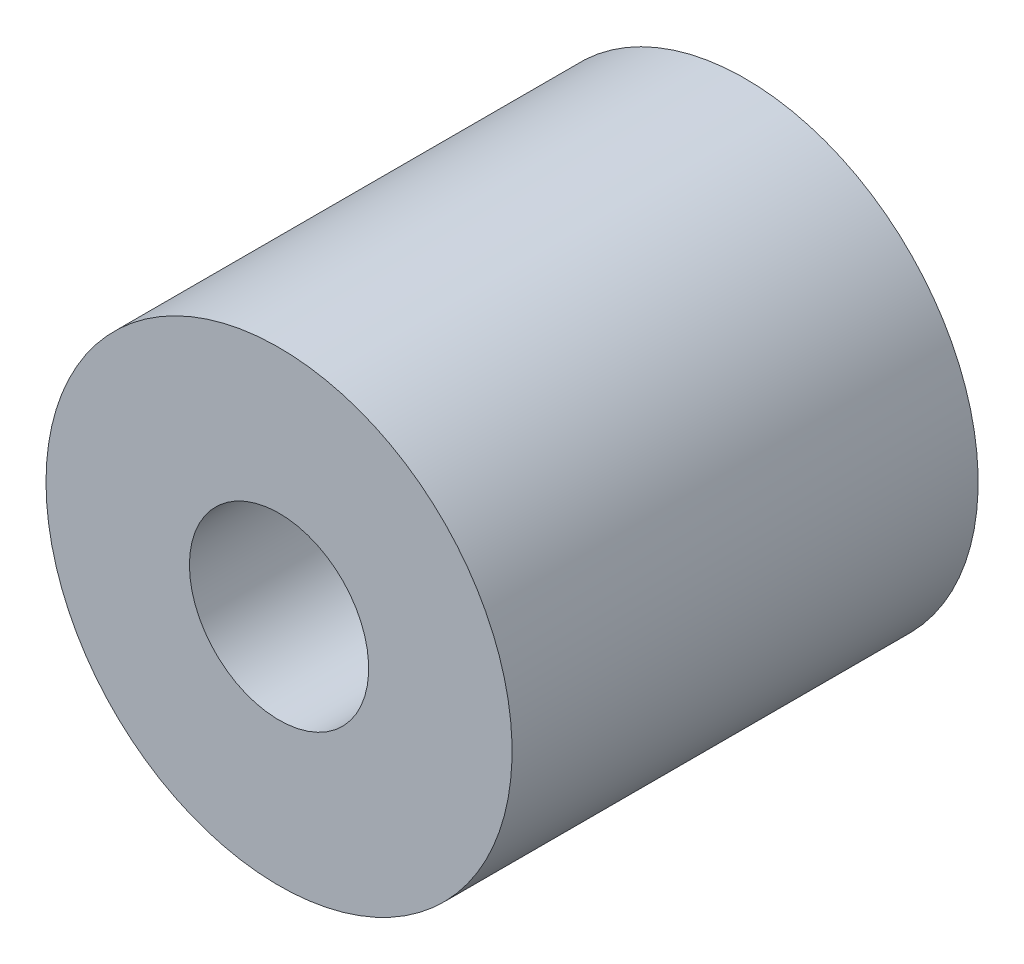
ISO-10303-21;
HEADER;
FILE_DESCRIPTION(('STEP AP214'),'2;1');
FILE_NAME('part.step','',(''),(''),'','','');
FILE_SCHEMA(('AUTOMOTIVE_DESIGN { 1 0 10303 214 1 1 1 1 }'));
ENDSEC;
DATA;
#1=APPLICATION_CONTEXT('core data for automotive mechanical design processes');
#2=APPLICATION_PROTOCOL_DEFINITION('international standard','automotive_design',2000,#1);
#3=PRODUCT_CONTEXT('',#1,'mechanical');
#4=PRODUCT('Part','Part','',(#3));
#5=PRODUCT_RELATED_PRODUCT_CATEGORY('part','',(#4));
#6=PRODUCT_DEFINITION_FORMATION('','',#4);
#7=PRODUCT_DEFINITION_CONTEXT('part definition',#1,'design');
#8=PRODUCT_DEFINITION('design','',#6,#7);
#9=PRODUCT_DEFINITION_SHAPE('','',#8);
#10=(LENGTH_UNIT() NAMED_UNIT(*) SI_UNIT(.MILLI.,.METRE.));
#11=(NAMED_UNIT(*) PLANE_ANGLE_UNIT() SI_UNIT($,.RADIAN.));
#12=(NAMED_UNIT(*) SI_UNIT($,.STERADIAN.) SOLID_ANGLE_UNIT());
#13=UNCERTAINTY_MEASURE_WITH_UNIT(LENGTH_MEASURE(1.E-05),#10,'distance_accuracy_value','');
#14=(GEOMETRIC_REPRESENTATION_CONTEXT(3) GLOBAL_UNCERTAINTY_ASSIGNED_CONTEXT((#13)) GLOBAL_UNIT_ASSIGNED_CONTEXT((#10,
#11,#12)) REPRESENTATION_CONTEXT('',''));
#15=CARTESIAN_POINT('',(0.,0.,0.));
#16=DIRECTION('',(0.,0.,1.));
#17=DIRECTION('',(1.,0.,0.));
#18=AXIS2_PLACEMENT_3D('',#15,#16,#17);
#19=CARTESIAN_POINT('',(0.,0.,26.));
#20=DIRECTION('',(0.,0.,1.));
#21=DIRECTION('',(1.,0.,0.));
#22=AXIS2_PLACEMENT_3D('',#19,#20,#21);
#23=PLANE('',#22);
#24=CARTESIAN_POINT('',(0.,0.,26.));
#25=DIRECTION('',(0.,0.,1.));
#26=DIRECTION('',(1.,0.,0.));
#27=AXIS2_PLACEMENT_3D('',#24,#25,#26);
#28=CIRCLE('',#27,13.);
#29=CARTESIAN_POINT('',(-13.,0.,26.));
#30=VERTEX_POINT('',#29);
#31=EDGE_CURVE('E10',#30,#30,#28,.T.);
#32=ORIENTED_EDGE('',*,*,#31,.T.);
#33=EDGE_LOOP('',(#32));
#34=FACE_BOUND('',#33,.T.);
#35=CARTESIAN_POINT('',(0.,0.,26.));
#36=DIRECTION('',(0.,0.,1.));
#37=DIRECTION('',(1.,0.,0.));
#38=AXIS2_PLACEMENT_3D('',#35,#36,#37);
#39=CIRCLE('',#38,5.);
#40=CARTESIAN_POINT('',(-5.,0.,26.));
#41=VERTEX_POINT('',#40);
#42=EDGE_CURVE('E50',#41,#41,#39,.T.);
#43=ORIENTED_EDGE('',*,*,#42,.F.);
#44=EDGE_LOOP('',(#43));
#45=FACE_BOUND('',#44,.T.);
#46=ADVANCED_FACE('F39',(#34,#45),#23,.T.);
#47=CARTESIAN_POINT('',(0.,0.,0.));
#48=DIRECTION('',(0.,0.,1.));
#49=DIRECTION('',(1.,0.,0.));
#50=AXIS2_PLACEMENT_3D('',#47,#48,#49);
#51=PLANE('',#50);
#52=CARTESIAN_POINT('',(0.,0.,0.));
#53=DIRECTION('',(0.,0.,1.));
#54=DIRECTION('',(1.,0.,0.));
#55=AXIS2_PLACEMENT_3D('',#52,#53,#54);
#56=CIRCLE('',#55,13.);
#57=CARTESIAN_POINT('',(-13.,0.,0.));
#58=VERTEX_POINT('',#57);
#59=EDGE_CURVE('E43',#58,#58,#56,.T.);
#60=ORIENTED_EDGE('',*,*,#59,.F.);
#61=EDGE_LOOP('',(#60));
#62=FACE_BOUND('',#61,.T.);
#63=CARTESIAN_POINT('',(0.,0.,0.));
#64=DIRECTION('',(0.,0.,1.));
#65=DIRECTION('',(1.,0.,0.));
#66=AXIS2_PLACEMENT_3D('',#63,#64,#65);
#67=CIRCLE('',#66,5.);
#68=CARTESIAN_POINT('',(-5.,0.,0.));
#69=VERTEX_POINT('',#68);
#70=EDGE_CURVE('E52',#69,#69,#67,.T.);
#71=ORIENTED_EDGE('',*,*,#70,.T.);
#72=EDGE_LOOP('',(#71));
#73=FACE_BOUND('',#72,.T.);
#74=ADVANCED_FACE('F62',(#62,#73),#51,.F.);
#75=CARTESIAN_POINT('',(0.,0.,26.));
#76=DIRECTION('',(0.,0.,-1.));
#77=DIRECTION('',(-1.,0.,0.));
#78=AXIS2_PLACEMENT_3D('',#75,#76,#77);
#79=CYLINDRICAL_SURFACE('',#78,13.);
#80=CARTESIAN_POINT('',(-13.,0.,26.));
#81=CARTESIAN_POINT('',(-13.,0.,25.7291666666667));
#82=CARTESIAN_POINT('',(-13.,0.,25.4583333333333));
#83=CARTESIAN_POINT('',(-13.,0.,24.9166666666667));
#84=CARTESIAN_POINT('',(-13.,0.,24.6458333333333));
#85=CARTESIAN_POINT('',(-13.,0.,24.1041666666667));
#86=CARTESIAN_POINT('',(-13.,0.,23.8333333333333));
#87=CARTESIAN_POINT('',(-13.,0.,23.2916666666667));
#88=CARTESIAN_POINT('',(-13.,0.,23.0208333333333));
#89=CARTESIAN_POINT('',(-13.,0.,22.4791666666667));
#90=CARTESIAN_POINT('',(-13.,0.,22.2083333333333));
#91=CARTESIAN_POINT('',(-13.,0.,21.6666666666667));
#92=CARTESIAN_POINT('',(-13.,0.,21.3958333333333));
#93=CARTESIAN_POINT('',(-13.,0.,20.8541666666667));
#94=CARTESIAN_POINT('',(-13.,0.,20.5833333333333));
#95=CARTESIAN_POINT('',(-13.,0.,20.0416666666667));
#96=CARTESIAN_POINT('',(-13.,0.,19.7708333333333));
#97=CARTESIAN_POINT('',(-13.,0.,19.2291666666667));
#98=CARTESIAN_POINT('',(-13.,0.,18.9583333333333));
#99=CARTESIAN_POINT('',(-13.,0.,18.4166666666667));
#100=CARTESIAN_POINT('',(-13.,0.,18.1458333333333));
#101=CARTESIAN_POINT('',(-13.,0.,17.6041666666667));
#102=CARTESIAN_POINT('',(-13.,0.,17.3333333333333));
#103=CARTESIAN_POINT('',(-13.,0.,16.7916666666667));
#104=CARTESIAN_POINT('',(-13.,0.,16.5208333333333));
#105=CARTESIAN_POINT('',(-13.,0.,15.9791666666667));
#106=CARTESIAN_POINT('',(-13.,0.,15.7083333333333));
#107=CARTESIAN_POINT('',(-13.,0.,15.1666666666667));
#108=CARTESIAN_POINT('',(-13.,0.,14.8958333333333));
#109=CARTESIAN_POINT('',(-13.,0.,14.3541666666667));
#110=CARTESIAN_POINT('',(-13.,0.,14.0833333333333));
#111=CARTESIAN_POINT('',(-13.,0.,13.5416666666667));
#112=CARTESIAN_POINT('',(-13.,0.,13.2708333333333));
#113=CARTESIAN_POINT('',(-13.,0.,12.7291666666667));
#114=CARTESIAN_POINT('',(-13.,0.,12.4583333333333));
#115=CARTESIAN_POINT('',(-13.,0.,11.9166666666667));
#116=CARTESIAN_POINT('',(-13.,0.,11.6458333333333));
#117=CARTESIAN_POINT('',(-13.,0.,11.1041666666667));
#118=CARTESIAN_POINT('',(-13.,0.,10.8333333333333));
#119=CARTESIAN_POINT('',(-13.,0.,10.2916666666667));
#120=CARTESIAN_POINT('',(-13.,0.,10.0208333333333));
#121=CARTESIAN_POINT('',(-13.,0.,9.47916666666667));
#122=CARTESIAN_POINT('',(-13.,0.,9.20833333333333));
#123=CARTESIAN_POINT('',(-13.,0.,8.66666666666667));
#124=CARTESIAN_POINT('',(-13.,0.,8.39583333333333));
#125=CARTESIAN_POINT('',(-13.,0.,7.85416666666667));
#126=CARTESIAN_POINT('',(-13.,0.,7.58333333333333));
#127=CARTESIAN_POINT('',(-13.,0.,7.04166666666667));
#128=CARTESIAN_POINT('',(-13.,0.,6.77083333333333));
#129=CARTESIAN_POINT('',(-13.,0.,6.22916666666667));
#130=CARTESIAN_POINT('',(-13.,0.,5.95833333333333));
#131=CARTESIAN_POINT('',(-13.,0.,5.41666666666667));
#132=CARTESIAN_POINT('',(-13.,0.,5.14583333333333));
#133=CARTESIAN_POINT('',(-13.,0.,4.60416666666667));
#134=CARTESIAN_POINT('',(-13.,0.,4.33333333333333));
#135=CARTESIAN_POINT('',(-13.,0.,3.79166666666667));
#136=CARTESIAN_POINT('',(-13.,0.,3.52083333333333));
#137=CARTESIAN_POINT('',(-13.,0.,2.97916666666667));
#138=CARTESIAN_POINT('',(-13.,0.,2.70833333333333));
#139=CARTESIAN_POINT('',(-13.,0.,2.16666666666667));
#140=CARTESIAN_POINT('',(-13.,0.,1.89583333333333));
#141=CARTESIAN_POINT('',(-13.,0.,1.35416666666667));
#142=CARTESIAN_POINT('',(-13.,0.,1.08333333333333));
#143=CARTESIAN_POINT('',(-13.,0.,0.541666666666667));
#144=CARTESIAN_POINT('',(-13.,0.,0.270833333333334));
#145=CARTESIAN_POINT('',(-13.,0.,0.));
#146=B_SPLINE_CURVE_WITH_KNOTS('',3,(#80,#81,#82,#83,#84,#85,#86,#87,#88,#89,#90,#91,#92,#93,
#94,#95,#96,#97,#98,#99,#100,#101,#102,#103,#104,#105,#106,#107,#108,#109,#110,#111,#112,#113,
#114,#115,#116,#117,#118,#119,#120,#121,#122,#123,#124,#125,#126,#127,#128,#129,#130,#131,#132,
#133,#134,#135,#136,#137,#138,#139,#140,#141,#142,#143,#144,#145),.UNSPECIFIED.,.F.,.F.,(4,2,2,
2,2,2,2,2,2,2,2,2,2,2,2,2,2,2,2,2,2,2,2,2,2,2,2,2,2,2,2,2,4),(0.,0.812499999999997,1.625,2.4375,
3.25,4.0625,4.875,5.6875,6.5,7.3125,8.125,8.93749999999999,9.74999999999999,10.5625,11.375,
12.1875,13.,13.8125,14.625,15.4375,16.25,17.0625,17.875,18.6875,19.5,20.3125,21.125,21.9375,
22.75,23.5625,24.375,25.1875,26.),.UNSPECIFIED.);
#147=EDGE_CURVE('BSEAM41',#30,#58,#146,.T.);
#148=ORIENTED_EDGE('',*,*,#31,.F.);
#149=ORIENTED_EDGE('',*,*,#59,.T.);
#150=ORIENTED_EDGE('',*,*,#147,.T.);
#151=ORIENTED_EDGE('',*,*,#147,.F.);
#152=EDGE_LOOP('',(#148,#150,#149,#151));
#153=FACE_BOUND('',#152,.T.);
#154=ADVANCED_FACE('F41',(#153),#79,.T.);
#155=CARTESIAN_POINT('',(0.,0.,26.));
#156=DIRECTION('',(0.,0.,-1.));
#157=DIRECTION('',(-1.,0.,0.));
#158=AXIS2_PLACEMENT_3D('',#155,#156,#157);
#159=CYLINDRICAL_SURFACE('',#158,5.);
#160=CARTESIAN_POINT('',(-5.,0.,26.));
#161=CARTESIAN_POINT('',(-5.,0.,25.7291666666667));
#162=CARTESIAN_POINT('',(-5.,0.,25.4583333333333));
#163=CARTESIAN_POINT('',(-5.,0.,24.9166666666667));
#164=CARTESIAN_POINT('',(-5.,0.,24.6458333333333));
#165=CARTESIAN_POINT('',(-5.,0.,24.1041666666667));
#166=CARTESIAN_POINT('',(-5.,0.,23.8333333333333));
#167=CARTESIAN_POINT('',(-5.,0.,23.2916666666667));
#168=CARTESIAN_POINT('',(-5.,0.,23.0208333333333));
#169=CARTESIAN_POINT('',(-5.,0.,22.4791666666667));
#170=CARTESIAN_POINT('',(-5.,0.,22.2083333333333));
#171=CARTESIAN_POINT('',(-5.,0.,21.6666666666667));
#172=CARTESIAN_POINT('',(-5.,0.,21.3958333333333));
#173=CARTESIAN_POINT('',(-5.,0.,20.8541666666667));
#174=CARTESIAN_POINT('',(-5.,0.,20.5833333333333));
#175=CARTESIAN_POINT('',(-5.,0.,20.0416666666667));
#176=CARTESIAN_POINT('',(-5.,0.,19.7708333333333));
#177=CARTESIAN_POINT('',(-5.,0.,19.2291666666667));
#178=CARTESIAN_POINT('',(-5.,0.,18.9583333333333));
#179=CARTESIAN_POINT('',(-5.,0.,18.4166666666667));
#180=CARTESIAN_POINT('',(-5.,0.,18.1458333333333));
#181=CARTESIAN_POINT('',(-5.,0.,17.6041666666667));
#182=CARTESIAN_POINT('',(-5.,0.,17.3333333333333));
#183=CARTESIAN_POINT('',(-5.,0.,16.7916666666667));
#184=CARTESIAN_POINT('',(-5.,0.,16.5208333333333));
#185=CARTESIAN_POINT('',(-5.,0.,15.9791666666667));
#186=CARTESIAN_POINT('',(-5.,0.,15.7083333333333));
#187=CARTESIAN_POINT('',(-5.,0.,15.1666666666667));
#188=CARTESIAN_POINT('',(-5.,0.,14.8958333333333));
#189=CARTESIAN_POINT('',(-5.,0.,14.3541666666667));
#190=CARTESIAN_POINT('',(-5.,0.,14.0833333333333));
#191=CARTESIAN_POINT('',(-5.,0.,13.5416666666667));
#192=CARTESIAN_POINT('',(-5.,0.,13.2708333333333));
#193=CARTESIAN_POINT('',(-5.,0.,12.7291666666667));
#194=CARTESIAN_POINT('',(-5.,0.,12.4583333333333));
#195=CARTESIAN_POINT('',(-5.,0.,11.9166666666667));
#196=CARTESIAN_POINT('',(-5.,0.,11.6458333333333));
#197=CARTESIAN_POINT('',(-5.,0.,11.1041666666667));
#198=CARTESIAN_POINT('',(-5.,0.,10.8333333333333));
#199=CARTESIAN_POINT('',(-5.,0.,10.2916666666667));
#200=CARTESIAN_POINT('',(-5.,0.,10.0208333333333));
#201=CARTESIAN_POINT('',(-5.,0.,9.47916666666667));
#202=CARTESIAN_POINT('',(-5.,0.,9.20833333333333));
#203=CARTESIAN_POINT('',(-5.,0.,8.66666666666667));
#204=CARTESIAN_POINT('',(-5.,0.,8.39583333333333));
#205=CARTESIAN_POINT('',(-5.,0.,7.85416666666667));
#206=CARTESIAN_POINT('',(-5.,0.,7.58333333333333));
#207=CARTESIAN_POINT('',(-5.,0.,7.04166666666667));
#208=CARTESIAN_POINT('',(-5.,0.,6.77083333333333));
#209=CARTESIAN_POINT('',(-5.,0.,6.22916666666667));
#210=CARTESIAN_POINT('',(-5.,0.,5.95833333333333));
#211=CARTESIAN_POINT('',(-5.,0.,5.41666666666667));
#212=CARTESIAN_POINT('',(-5.,0.,5.14583333333333));
#213=CARTESIAN_POINT('',(-5.,0.,4.60416666666667));
#214=CARTESIAN_POINT('',(-5.,0.,4.33333333333333));
#215=CARTESIAN_POINT('',(-5.,0.,3.79166666666667));
#216=CARTESIAN_POINT('',(-5.,0.,3.52083333333333));
#217=CARTESIAN_POINT('',(-5.,0.,2.97916666666667));
#218=CARTESIAN_POINT('',(-5.,0.,2.70833333333333));
#219=CARTESIAN_POINT('',(-5.,0.,2.16666666666667));
#220=CARTESIAN_POINT('',(-5.,0.,1.89583333333333));
#221=CARTESIAN_POINT('',(-5.,0.,1.35416666666667));
#222=CARTESIAN_POINT('',(-5.,0.,1.08333333333333));
#223=CARTESIAN_POINT('',(-5.,0.,0.541666666666667));
#224=CARTESIAN_POINT('',(-5.,0.,0.270833333333334));
#225=CARTESIAN_POINT('',(-5.,0.,0.));
#226=B_SPLINE_CURVE_WITH_KNOTS('',3,(#160,#161,#162,#163,#164,#165,#166,#167,#168,#169,#170,
#171,#172,#173,#174,#175,#176,#177,#178,#179,#180,#181,#182,#183,#184,#185,#186,#187,#188,#189,
#190,#191,#192,#193,#194,#195,#196,#197,#198,#199,#200,#201,#202,#203,#204,#205,#206,#207,#208,
#209,#210,#211,#212,#213,#214,#215,#216,#217,#218,#219,#220,#221,#222,#223,#224,#225),
.UNSPECIFIED.,.F.,.F.,(4,2,2,2,2,2,2,2,2,2,2,2,2,2,2,2,2,2,2,2,2,2,2,2,2,2,2,2,2,2,2,2,4),(0.,
0.812499999999997,1.625,2.4375,3.25,4.0625,4.875,5.6875,6.5,7.3125,8.125,8.93749999999999,
9.74999999999999,10.5625,11.375,12.1875,13.,13.8125,14.625,15.4375,16.25,17.0625,17.875,18.6875,
19.5,20.3125,21.125,21.9375,22.75,23.5625,24.375,25.1875,26.),.UNSPECIFIED.);
#227=EDGE_CURVE('BSEAM58',#41,#69,#226,.T.);
#228=ORIENTED_EDGE('',*,*,#42,.T.);
#229=ORIENTED_EDGE('',*,*,#70,.F.);
#230=ORIENTED_EDGE('',*,*,#227,.T.);
#231=ORIENTED_EDGE('',*,*,#227,.F.);
#232=EDGE_LOOP('',(#228,#230,#229,#231));
#233=FACE_BOUND('',#232,.T.);
#234=ADVANCED_FACE('F58',(#233),#159,.F.);
#235=CLOSED_SHELL('',(#46,#74,#154,#234));
#236=MANIFOLD_SOLID_BREP('B2',#235);
#237=ADVANCED_BREP_SHAPE_REPRESENTATION('',(#18,#236),#14);
#238=SHAPE_DEFINITION_REPRESENTATION(#9,#237);
ENDSEC;
END-ISO-10303-21;
